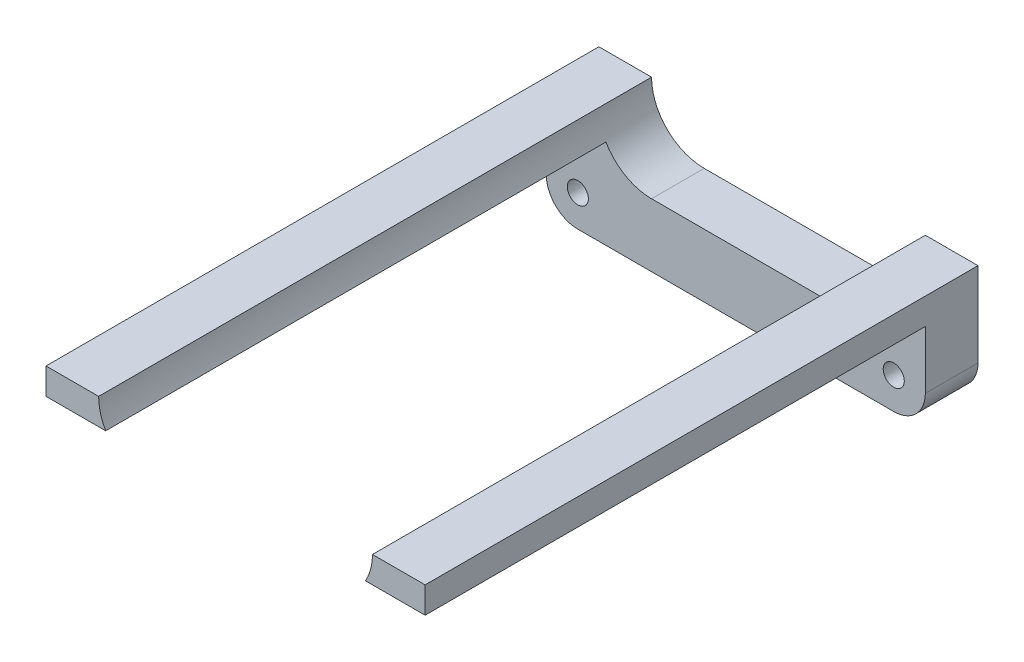
ISO-10303-21;
HEADER;
FILE_DESCRIPTION(('STEP AP214'),'2;1');
FILE_NAME('part.step','',(''),(''),'','','');
FILE_SCHEMA(('AUTOMOTIVE_DESIGN { 1 0 10303 214 1 1 1 1 }'));
ENDSEC;
DATA;
#1=APPLICATION_CONTEXT('core data for automotive mechanical design processes');
#2=APPLICATION_PROTOCOL_DEFINITION('international standard','automotive_design',2000,#1);
#3=PRODUCT_CONTEXT('',#1,'mechanical');
#4=PRODUCT('Part','Part','',(#3));
#5=PRODUCT_RELATED_PRODUCT_CATEGORY('part','',(#4));
#6=PRODUCT_DEFINITION_FORMATION('','',#4);
#7=PRODUCT_DEFINITION_CONTEXT('part definition',#1,'design');
#8=PRODUCT_DEFINITION('design','',#6,#7);
#9=PRODUCT_DEFINITION_SHAPE('','',#8);
#10=(LENGTH_UNIT() NAMED_UNIT(*) SI_UNIT(.MILLI.,.METRE.));
#11=(NAMED_UNIT(*) PLANE_ANGLE_UNIT() SI_UNIT($,.RADIAN.));
#12=(NAMED_UNIT(*) SI_UNIT($,.STERADIAN.) SOLID_ANGLE_UNIT());
#13=UNCERTAINTY_MEASURE_WITH_UNIT(LENGTH_MEASURE(1.E-05),#10,'distance_accuracy_value','');
#14=(GEOMETRIC_REPRESENTATION_CONTEXT(3) GLOBAL_UNCERTAINTY_ASSIGNED_CONTEXT((#13)) GLOBAL_UNIT_ASSIGNED_CONTEXT((#10,
#11,#12)) REPRESENTATION_CONTEXT('',''));
#15=CARTESIAN_POINT('',(0.,0.,0.));
#16=DIRECTION('',(0.,0.,1.));
#17=DIRECTION('',(1.,0.,0.));
#18=AXIS2_PLACEMENT_3D('',#15,#16,#17);
#19=CARTESIAN_POINT('',(0.,0.,5.));
#20=DIRECTION('',(0.,0.,1.));
#21=DIRECTION('',(1.,0.,0.));
#22=AXIS2_PLACEMENT_3D('',#19,#20,#21);
#23=PLANE('',#22);
#24=CARTESIAN_POINT('',(30.,0.,5.));
#25=DIRECTION('',(0.,0.,1.));
#26=DIRECTION('',(1.,0.,0.));
#27=AXIS2_PLACEMENT_3D('',#24,#25,#26);
#28=CIRCLE('',#27,2.);
#29=CARTESIAN_POINT('',(32.,0.,5.));
#30=VERTEX_POINT('',#29);
#31=EDGE_CURVE('E186',#30,#30,#28,.T.);
#32=ORIENTED_EDGE('',*,*,#31,.F.);
#33=EDGE_LOOP('',(#32));
#34=FACE_BOUND('',#33,.T.);
#35=CARTESIAN_POINT('',(-30.,0.,5.));
#36=DIRECTION('',(0.,0.,1.));
#37=DIRECTION('',(1.,0.,0.));
#38=AXIS2_PLACEMENT_3D('',#35,#36,#37);
#39=CIRCLE('',#38,2.);
#40=CARTESIAN_POINT('',(-28.,0.,5.));
#41=VERTEX_POINT('',#40);
#42=EDGE_CURVE('E189',#41,#41,#39,.T.);
#43=ORIENTED_EDGE('',*,*,#42,.F.);
#44=EDGE_LOOP('',(#43));
#45=FACE_BOUND('',#44,.T.);
#46=DIRECTION('',(1.,0.,0.));
#47=VECTOR('',#46,1.);
#48=CARTESIAN_POINT('',(0.,6.00000000000002,5.));
#49=LINE('',#48,#47);
#50=CARTESIAN_POINT('',(-16.,6.00000000000002,5.));
#51=VERTEX_POINT('',#50);
#52=CARTESIAN_POINT('',(16.,6.00000000000002,5.));
#53=VERTEX_POINT('',#52);
#54=EDGE_CURVE('E183',#51,#53,#49,.T.);
#55=ORIENTED_EDGE('',*,*,#54,.F.);
#56=CARTESIAN_POINT('',(-16.,16.,5.));
#57=DIRECTION('',(0.,0.,1.));
#58=DIRECTION('',(1.,0.,0.));
#59=AXIS2_PLACEMENT_3D('',#56,#57,#58);
#60=CIRCLE('',#59,10.);
#61=CARTESIAN_POINT('',(-24.6602540378444,11.,5.));
#62=VERTEX_POINT('',#61);
#63=EDGE_CURVE('E258',#51,#62,#60,.F.);
#64=ORIENTED_EDGE('',*,*,#63,.T.);
#65=DIRECTION('',(-1.,0.,0.));
#66=VECTOR('',#65,1.);
#67=CARTESIAN_POINT('',(0.,11.,5.));
#68=LINE('',#67,#66);
#69=CARTESIAN_POINT('',(-36.,11.,5.));
#70=VERTEX_POINT('',#69);
#71=EDGE_CURVE('E64',#62,#70,#68,.T.);
#72=ORIENTED_EDGE('',*,*,#71,.T.);
#73=DIRECTION('',(0.,1.,0.));
#74=VECTOR('',#73,1.);
#75=CARTESIAN_POINT('',(-36.,0.,5.));
#76=LINE('',#75,#74);
#77=CARTESIAN_POINT('',(-36.,0.,5.));
#78=VERTEX_POINT('',#77);
#79=EDGE_CURVE('E149',#78,#70,#76,.T.);
#80=ORIENTED_EDGE('',*,*,#79,.F.);
#81=CARTESIAN_POINT('',(-30.,0.,5.));
#82=DIRECTION('',(0.,0.,1.));
#83=DIRECTION('',(1.,0.,0.));
#84=AXIS2_PLACEMENT_3D('',#81,#82,#83);
#85=CIRCLE('',#84,6.00000000000001);
#86=CARTESIAN_POINT('',(-30.,-6.00000000000001,5.));
#87=VERTEX_POINT('',#86);
#88=EDGE_CURVE('E174',#78,#87,#85,.T.);
#89=ORIENTED_EDGE('',*,*,#88,.T.);
#90=DIRECTION('',(1.,0.,0.));
#91=VECTOR('',#90,1.);
#92=CARTESIAN_POINT('',(0.,-6.00000000000001,5.));
#93=LINE('',#92,#91);
#94=CARTESIAN_POINT('',(30.,-6.,5.));
#95=VERTEX_POINT('',#94);
#96=EDGE_CURVE('E177',#87,#95,#93,.T.);
#97=ORIENTED_EDGE('',*,*,#96,.T.);
#98=CARTESIAN_POINT('',(30.,0.,5.));
#99=DIRECTION('',(0.,0.,1.));
#100=DIRECTION('',(1.,0.,0.));
#101=AXIS2_PLACEMENT_3D('',#98,#99,#100);
#102=CIRCLE('',#101,6.00000000000001);
#103=CARTESIAN_POINT('',(36.,0.,5.));
#104=VERTEX_POINT('',#103);
#105=EDGE_CURVE('E179',#95,#104,#102,.T.);
#106=ORIENTED_EDGE('',*,*,#105,.T.);
#107=DIRECTION('',(0.,1.,0.));
#108=VECTOR('',#107,1.);
#109=CARTESIAN_POINT('',(36.,0.,5.));
#110=LINE('',#109,#108);
#111=CARTESIAN_POINT('',(36.,11.,5.));
#112=VERTEX_POINT('',#111);
#113=EDGE_CURVE('E181',#104,#112,#110,.T.);
#114=ORIENTED_EDGE('',*,*,#113,.T.);
#115=DIRECTION('',(-1.,0.,0.));
#116=VECTOR('',#115,1.);
#117=CARTESIAN_POINT('',(0.,11.,5.));
#118=LINE('',#117,#116);
#119=CARTESIAN_POINT('',(24.6602540378444,11.,5.));
#120=VERTEX_POINT('',#119);
#121=EDGE_CURVE('E238',#112,#120,#118,.T.);
#122=ORIENTED_EDGE('',*,*,#121,.T.);
#123=CARTESIAN_POINT('',(16.,16.,5.));
#124=DIRECTION('',(0.,0.,1.));
#125=DIRECTION('',(1.,0.,0.));
#126=AXIS2_PLACEMENT_3D('',#123,#124,#125);
#127=CIRCLE('',#126,10.);
#128=EDGE_CURVE('E254',#120,#53,#127,.F.);
#129=ORIENTED_EDGE('',*,*,#128,.T.);
#130=EDGE_LOOP('',(#55,#64,#72,#80,#89,#97,#106,#114,#122,#129));
#131=FACE_BOUND('',#130,.T.);
#132=ADVANCED_FACE('F43',(#34,#45,#131),#23,.T.);
#133=CARTESIAN_POINT('',(-36.,0.,5.));
#134=DIRECTION('',(-1.,0.,0.));
#135=DIRECTION('',(0.,-1.,0.));
#136=AXIS2_PLACEMENT_3D('',#133,#134,#135);
#137=PLANE('',#136);
#138=ORIENTED_EDGE('',*,*,#79,.T.);
#139=DIRECTION('',(0.,0.,-1.));
#140=VECTOR('',#139,1.);
#141=CARTESIAN_POINT('',(-36.,11.,100.));
#142=LINE('',#141,#140);
#143=CARTESIAN_POINT('',(-36.,11.,100.));
#144=VERTEX_POINT('',#143);
#145=EDGE_CURVE('E144',#144,#70,#142,.T.);
#146=ORIENTED_EDGE('',*,*,#145,.F.);
#147=DIRECTION('',(0.,1.,0.));
#148=VECTOR('',#147,1.);
#149=CARTESIAN_POINT('',(-36.,0.,100.));
#150=LINE('',#149,#148);
#151=CARTESIAN_POINT('',(-36.,16.,100.));
#152=VERTEX_POINT('',#151);
#153=EDGE_CURVE('E146',#144,#152,#150,.T.);
#154=ORIENTED_EDGE('',*,*,#153,.T.);
#155=DIRECTION('',(0.,0.,-1.));
#156=VECTOR('',#155,1.);
#157=CARTESIAN_POINT('',(-36.,16.,5.));
#158=LINE('',#157,#156);
#159=CARTESIAN_POINT('',(-36.,16.,-5.));
#160=VERTEX_POINT('',#159);
#161=EDGE_CURVE('E192',#152,#160,#158,.T.);
#162=ORIENTED_EDGE('',*,*,#161,.T.);
#163=DIRECTION('',(0.,1.,0.));
#164=VECTOR('',#163,1.);
#165=CARTESIAN_POINT('',(-36.,0.,-5.));
#166=LINE('',#165,#164);
#167=CARTESIAN_POINT('',(-36.,0.,-5.));
#168=VERTEX_POINT('',#167);
#169=EDGE_CURVE('E150',#168,#160,#166,.T.);
#170=ORIENTED_EDGE('',*,*,#169,.F.);
#171=DIRECTION('',(0.,0.,-1.));
#172=VECTOR('',#171,1.);
#173=CARTESIAN_POINT('',(-36.,0.,5.));
#174=LINE('',#173,#172);
#175=EDGE_CURVE('E236',#78,#168,#174,.T.);
#176=ORIENTED_EDGE('',*,*,#175,.F.);
#177=EDGE_LOOP('',(#138,#146,#154,#162,#170,#176));
#178=FACE_BOUND('',#177,.T.);
#179=ADVANCED_FACE('F145',(#178),#137,.T.);
#180=CARTESIAN_POINT('',(-30.,0.,5.));
#181=DIRECTION('',(0.,0.,-1.));
#182=DIRECTION('',(-1.,0.,0.));
#183=AXIS2_PLACEMENT_3D('',#180,#181,#182);
#184=CYLINDRICAL_SURFACE('',#183,6.00000000000001);
#185=CARTESIAN_POINT('',(-30.,0.,-5.));
#186=DIRECTION('',(0.,0.,1.));
#187=DIRECTION('',(1.,0.,0.));
#188=AXIS2_PLACEMENT_3D('',#185,#186,#187);
#189=CIRCLE('',#188,6.00000000000001);
#190=CARTESIAN_POINT('',(-30.,-6.00000000000001,-5.));
#191=VERTEX_POINT('',#190);
#192=EDGE_CURVE('E195',#168,#191,#189,.T.);
#193=ORIENTED_EDGE('',*,*,#192,.T.);
#194=DIRECTION('',(0.,0.,-1.));
#195=VECTOR('',#194,1.);
#196=CARTESIAN_POINT('',(-30.,-6.00000000000001,5.));
#197=LINE('',#196,#195);
#198=EDGE_CURVE('E233',#87,#191,#197,.T.);
#199=ORIENTED_EDGE('',*,*,#198,.F.);
#200=ORIENTED_EDGE('',*,*,#88,.F.);
#201=ORIENTED_EDGE('',*,*,#175,.T.);
#202=EDGE_LOOP('',(#193,#199,#200,#201));
#203=FACE_BOUND('',#202,.T.);
#204=ADVANCED_FACE('F277',(#203),#184,.T.);
#205=CARTESIAN_POINT('',(0.,-6.00000000000001,5.));
#206=DIRECTION('',(0.,1.,0.));
#207=DIRECTION('',(-1.,0.,0.));
#208=AXIS2_PLACEMENT_3D('',#205,#206,#207);
#209=PLANE('',#208);
#210=DIRECTION('',(1.,0.,0.));
#211=VECTOR('',#210,1.);
#212=CARTESIAN_POINT('',(0.,-6.00000000000001,-5.));
#213=LINE('',#212,#211);
#214=CARTESIAN_POINT('',(30.,-6.,-5.));
#215=VERTEX_POINT('',#214);
#216=EDGE_CURVE('E197',#191,#215,#213,.T.);
#217=ORIENTED_EDGE('',*,*,#216,.T.);
#218=DIRECTION('',(0.,0.,-1.));
#219=VECTOR('',#218,1.);
#220=CARTESIAN_POINT('',(30.,-6.,5.));
#221=LINE('',#220,#219);
#222=EDGE_CURVE('E230',#95,#215,#221,.T.);
#223=ORIENTED_EDGE('',*,*,#222,.F.);
#224=ORIENTED_EDGE('',*,*,#96,.F.);
#225=ORIENTED_EDGE('',*,*,#198,.T.);
#226=EDGE_LOOP('',(#217,#223,#224,#225));
#227=FACE_BOUND('',#226,.T.);
#228=ADVANCED_FACE('F281',(#227),#209,.F.);
#229=CARTESIAN_POINT('',(30.,0.,5.));
#230=DIRECTION('',(0.,0.,-1.));
#231=DIRECTION('',(-1.,0.,0.));
#232=AXIS2_PLACEMENT_3D('',#229,#230,#231);
#233=CYLINDRICAL_SURFACE('',#232,6.00000000000001);
#234=CARTESIAN_POINT('',(30.,0.,-5.));
#235=DIRECTION('',(0.,0.,1.));
#236=DIRECTION('',(1.,0.,0.));
#237=AXIS2_PLACEMENT_3D('',#234,#235,#236);
#238=CIRCLE('',#237,6.00000000000001);
#239=CARTESIAN_POINT('',(36.,0.,-5.));
#240=VERTEX_POINT('',#239);
#241=EDGE_CURVE('E199',#215,#240,#238,.T.);
#242=ORIENTED_EDGE('',*,*,#241,.T.);
#243=DIRECTION('',(0.,0.,-1.));
#244=VECTOR('',#243,1.);
#245=CARTESIAN_POINT('',(36.,0.,5.));
#246=LINE('',#245,#244);
#247=EDGE_CURVE('E227',#104,#240,#246,.T.);
#248=ORIENTED_EDGE('',*,*,#247,.F.);
#249=ORIENTED_EDGE('',*,*,#105,.F.);
#250=ORIENTED_EDGE('',*,*,#222,.T.);
#251=EDGE_LOOP('',(#242,#248,#249,#250));
#252=FACE_BOUND('',#251,.T.);
#253=ADVANCED_FACE('F288',(#252),#233,.T.);
#254=CARTESIAN_POINT('',(36.,0.,5.));
#255=DIRECTION('',(-1.,0.,0.));
#256=DIRECTION('',(0.,-1.,0.));
#257=AXIS2_PLACEMENT_3D('',#254,#255,#256);
#258=PLANE('',#257);
#259=DIRECTION('',(0.,0.,-1.));
#260=VECTOR('',#259,1.);
#261=CARTESIAN_POINT('',(36.,16.,5.));
#262=LINE('',#261,#260);
#263=CARTESIAN_POINT('',(36.,16.,100.));
#264=VERTEX_POINT('',#263);
#265=CARTESIAN_POINT('',(36.,16.,-5.));
#266=VERTEX_POINT('',#265);
#267=EDGE_CURVE('E225',#264,#266,#262,.T.);
#268=ORIENTED_EDGE('',*,*,#267,.F.);
#269=DIRECTION('',(0.,1.,0.));
#270=VECTOR('',#269,1.);
#271=CARTESIAN_POINT('',(36.,0.,100.));
#272=LINE('',#271,#270);
#273=CARTESIAN_POINT('',(36.,11.,100.));
#274=VERTEX_POINT('',#273);
#275=EDGE_CURVE('E168',#274,#264,#272,.T.);
#276=ORIENTED_EDGE('',*,*,#275,.F.);
#277=DIRECTION('',(0.,0.,-1.));
#278=VECTOR('',#277,1.);
#279=CARTESIAN_POINT('',(36.,11.,100.));
#280=LINE('',#279,#278);
#281=EDGE_CURVE('E159',#274,#112,#280,.T.);
#282=ORIENTED_EDGE('',*,*,#281,.T.);
#283=ORIENTED_EDGE('',*,*,#113,.F.);
#284=ORIENTED_EDGE('',*,*,#247,.T.);
#285=DIRECTION('',(0.,1.,0.));
#286=VECTOR('',#285,1.);
#287=CARTESIAN_POINT('',(36.,0.,-5.));
#288=LINE('',#287,#286);
#289=EDGE_CURVE('E201',#240,#266,#288,.T.);
#290=ORIENTED_EDGE('',*,*,#289,.T.);
#291=EDGE_LOOP('',(#268,#276,#282,#283,#284,#290));
#292=FACE_BOUND('',#291,.T.);
#293=ADVANCED_FACE('F291',(#292),#258,.F.);
#294=CARTESIAN_POINT('',(0.,16.,5.));
#295=DIRECTION('',(0.,-1.,0.));
#296=DIRECTION('',(1.,0.,0.));
#297=AXIS2_PLACEMENT_3D('',#294,#295,#296);
#298=PLANE('',#297);
#299=ORIENTED_EDGE('',*,*,#267,.T.);
#300=DIRECTION('',(-1.,0.,0.));
#301=VECTOR('',#300,1.);
#302=CARTESIAN_POINT('',(0.,16.,-5.));
#303=LINE('',#302,#301);
#304=CARTESIAN_POINT('',(26.,16.,-5.));
#305=VERTEX_POINT('',#304);
#306=EDGE_CURVE('E204',#266,#305,#303,.T.);
#307=ORIENTED_EDGE('',*,*,#306,.T.);
#308=DIRECTION('',(0.,0.,-1.));
#309=VECTOR('',#308,1.);
#310=CARTESIAN_POINT('',(26.,16.,5.));
#311=LINE('',#310,#309);
#312=CARTESIAN_POINT('',(26.,16.,100.));
#313=VERTEX_POINT('',#312);
#314=EDGE_CURVE('E222',#313,#305,#311,.T.);
#315=ORIENTED_EDGE('',*,*,#314,.F.);
#316=DIRECTION('',(-1.,0.,0.));
#317=VECTOR('',#316,1.);
#318=CARTESIAN_POINT('',(0.,16.,100.));
#319=LINE('',#318,#317);
#320=EDGE_CURVE('E162',#264,#313,#319,.T.);
#321=ORIENTED_EDGE('',*,*,#320,.F.);
#322=EDGE_LOOP('',(#299,#307,#315,#321));
#323=FACE_BOUND('',#322,.T.);
#324=ADVANCED_FACE('F307',(#323),#298,.F.);
#325=CARTESIAN_POINT('',(0.,6.00000000000002,5.));
#326=DIRECTION('',(0.,1.,0.));
#327=DIRECTION('',(-1.,0.,0.));
#328=AXIS2_PLACEMENT_3D('',#325,#326,#327);
#329=PLANE('',#328);
#330=ORIENTED_EDGE('',*,*,#54,.T.);
#331=DIRECTION('',(0.,0.,-1.));
#332=VECTOR('',#331,1.);
#333=CARTESIAN_POINT('',(16.,6.00000000000002,5.));
#334=LINE('',#333,#332);
#335=CARTESIAN_POINT('',(16.,6.00000000000002,-5.));
#336=VERTEX_POINT('',#335);
#337=EDGE_CURVE('E243',#53,#336,#334,.T.);
#338=ORIENTED_EDGE('',*,*,#337,.T.);
#339=DIRECTION('',(1.,0.,0.));
#340=VECTOR('',#339,1.);
#341=CARTESIAN_POINT('',(0.,6.00000000000002,-5.));
#342=LINE('',#341,#340);
#343=CARTESIAN_POINT('',(-16.,6.00000000000002,-5.));
#344=VERTEX_POINT('',#343);
#345=EDGE_CURVE('E207',#344,#336,#342,.T.);
#346=ORIENTED_EDGE('',*,*,#345,.F.);
#347=DIRECTION('',(0.,0.,-1.));
#348=VECTOR('',#347,1.);
#349=CARTESIAN_POINT('',(-16.,6.00000000000002,5.));
#350=LINE('',#349,#348);
#351=EDGE_CURVE('E241',#344,#51,#350,.F.);
#352=ORIENTED_EDGE('',*,*,#351,.T.);
#353=EDGE_LOOP('',(#330,#338,#346,#352));
#354=FACE_BOUND('',#353,.T.);
#355=ADVANCED_FACE('F301',(#354),#329,.T.);
#356=CARTESIAN_POINT('',(30.,0.,5.));
#357=DIRECTION('',(0.,0.,-1.));
#358=DIRECTION('',(-1.,0.,0.));
#359=AXIS2_PLACEMENT_3D('',#356,#357,#358);
#360=CYLINDRICAL_SURFACE('',#359,2.);
#361=ORIENTED_EDGE('',*,*,#31,.T.);
#362=EDGE_LOOP('',(#361));
#363=FACE_BOUND('',#362,.T.);
#364=CARTESIAN_POINT('',(30.,0.,-5.));
#365=DIRECTION('',(0.,0.,1.));
#366=DIRECTION('',(1.,0.,0.));
#367=AXIS2_PLACEMENT_3D('',#364,#365,#366);
#368=CIRCLE('',#367,2.);
#369=CARTESIAN_POINT('',(32.,0.,-5.));
#370=VERTEX_POINT('',#369);
#371=EDGE_CURVE('E213',#370,#370,#368,.T.);
#372=ORIENTED_EDGE('',*,*,#371,.F.);
#373=EDGE_LOOP('',(#372));
#374=FACE_BOUND('',#373,.T.);
#375=ADVANCED_FACE('F337',(#363,#374),#360,.F.);
#376=CARTESIAN_POINT('',(0.,16.,5.));
#377=DIRECTION('',(0.,1.,0.));
#378=DIRECTION('',(-1.,0.,0.));
#379=AXIS2_PLACEMENT_3D('',#376,#377,#378);
#380=PLANE('',#379);
#381=DIRECTION('',(0.,0.,-1.));
#382=VECTOR('',#381,1.);
#383=CARTESIAN_POINT('',(-26.,16.,5.));
#384=LINE('',#383,#382);
#385=CARTESIAN_POINT('',(-26.,16.,100.));
#386=VERTEX_POINT('',#385);
#387=CARTESIAN_POINT('',(-26.,16.,-5.));
#388=VERTEX_POINT('',#387);
#389=EDGE_CURVE('E219',#386,#388,#384,.T.);
#390=ORIENTED_EDGE('',*,*,#389,.T.);
#391=DIRECTION('',(1.,0.,0.));
#392=VECTOR('',#391,1.);
#393=CARTESIAN_POINT('',(0.,16.,-5.));
#394=LINE('',#393,#392);
#395=EDGE_CURVE('E210',#160,#388,#394,.T.);
#396=ORIENTED_EDGE('',*,*,#395,.F.);
#397=ORIENTED_EDGE('',*,*,#161,.F.);
#398=DIRECTION('',(1.,0.,0.));
#399=VECTOR('',#398,1.);
#400=CARTESIAN_POINT('',(0.,16.,100.));
#401=LINE('',#400,#399);
#402=EDGE_CURVE('E151',#152,#386,#401,.T.);
#403=ORIENTED_EDGE('',*,*,#402,.T.);
#404=EDGE_LOOP('',(#390,#396,#397,#403));
#405=FACE_BOUND('',#404,.T.);
#406=ADVANCED_FACE('F266',(#405),#380,.T.);
#407=CARTESIAN_POINT('',(-30.,0.,5.));
#408=DIRECTION('',(0.,0.,-1.));
#409=DIRECTION('',(-1.,0.,0.));
#410=AXIS2_PLACEMENT_3D('',#407,#408,#409);
#411=CYLINDRICAL_SURFACE('',#410,2.);
#412=ORIENTED_EDGE('',*,*,#42,.T.);
#413=EDGE_LOOP('',(#412));
#414=FACE_BOUND('',#413,.T.);
#415=CARTESIAN_POINT('',(-30.,0.,-5.));
#416=DIRECTION('',(0.,0.,1.));
#417=DIRECTION('',(1.,0.,0.));
#418=AXIS2_PLACEMENT_3D('',#415,#416,#417);
#419=CIRCLE('',#418,2.);
#420=CARTESIAN_POINT('',(-28.,0.,-5.));
#421=VERTEX_POINT('',#420);
#422=EDGE_CURVE('E175',#421,#421,#419,.T.);
#423=ORIENTED_EDGE('',*,*,#422,.F.);
#424=EDGE_LOOP('',(#423));
#425=FACE_BOUND('',#424,.T.);
#426=ADVANCED_FACE('F333',(#414,#425),#411,.F.);
#427=CARTESIAN_POINT('',(0.,0.,-5.));
#428=DIRECTION('',(0.,0.,1.));
#429=DIRECTION('',(1.,0.,0.));
#430=AXIS2_PLACEMENT_3D('',#427,#428,#429);
#431=PLANE('',#430);
#432=ORIENTED_EDGE('',*,*,#169,.T.);
#433=ORIENTED_EDGE('',*,*,#395,.T.);
#434=CARTESIAN_POINT('',(-16.,16.,-5.));
#435=DIRECTION('',(0.,0.,1.));
#436=DIRECTION('',(1.,0.,0.));
#437=AXIS2_PLACEMENT_3D('',#434,#435,#436);
#438=CIRCLE('',#437,10.);
#439=EDGE_CURVE('E256',#388,#344,#438,.T.);
#440=ORIENTED_EDGE('',*,*,#439,.T.);
#441=ORIENTED_EDGE('',*,*,#345,.T.);
#442=CARTESIAN_POINT('',(16.,16.,-5.));
#443=DIRECTION('',(0.,0.,1.));
#444=DIRECTION('',(1.,0.,0.));
#445=AXIS2_PLACEMENT_3D('',#442,#443,#444);
#446=CIRCLE('',#445,10.);
#447=EDGE_CURVE('E246',#336,#305,#446,.T.);
#448=ORIENTED_EDGE('',*,*,#447,.T.);
#449=ORIENTED_EDGE('',*,*,#306,.F.);
#450=ORIENTED_EDGE('',*,*,#289,.F.);
#451=ORIENTED_EDGE('',*,*,#241,.F.);
#452=ORIENTED_EDGE('',*,*,#216,.F.);
#453=ORIENTED_EDGE('',*,*,#192,.F.);
#454=EDGE_LOOP('',(#432,#433,#440,#441,#448,#449,#450,#451,#452,#453));
#455=FACE_BOUND('',#454,.T.);
#456=ORIENTED_EDGE('',*,*,#371,.T.);
#457=EDGE_LOOP('',(#456));
#458=FACE_BOUND('',#457,.T.);
#459=ORIENTED_EDGE('',*,*,#422,.T.);
#460=EDGE_LOOP('',(#459));
#461=FACE_BOUND('',#460,.T.);
#462=ADVANCED_FACE('F271',(#455,#458,#461),#431,.F.);
#463=CARTESIAN_POINT('',(0.,11.,100.));
#464=DIRECTION('',(0.,1.,0.));
#465=DIRECTION('',(0.,0.,1.));
#466=AXIS2_PLACEMENT_3D('',#463,#464,#465);
#467=PLANE('',#466);
#468=ORIENTED_EDGE('',*,*,#121,.F.);
#469=ORIENTED_EDGE('',*,*,#281,.F.);
#470=DIRECTION('',(1.,0.,0.));
#471=VECTOR('',#470,1.);
#472=CARTESIAN_POINT('',(0.,11.,100.));
#473=LINE('',#472,#471);
#474=CARTESIAN_POINT('',(24.6602540378444,11.,100.));
#475=VERTEX_POINT('',#474);
#476=EDGE_CURVE('E166',#475,#274,#473,.T.);
#477=ORIENTED_EDGE('',*,*,#476,.F.);
#478=DIRECTION('',(0.,0.,-1.));
#479=VECTOR('',#478,1.);
#480=CARTESIAN_POINT('',(24.6602540378444,11.,100.));
#481=LINE('',#480,#479);
#482=EDGE_CURVE('E251',#475,#120,#481,.T.);
#483=ORIENTED_EDGE('',*,*,#482,.T.);
#484=EDGE_LOOP('',(#468,#469,#477,#483));
#485=FACE_BOUND('',#484,.T.);
#486=ADVANCED_FACE('F295',(#485),#467,.F.);
#487=CARTESIAN_POINT('',(0.,0.,100.));
#488=DIRECTION('',(0.,0.,1.));
#489=DIRECTION('',(1.,0.,0.));
#490=AXIS2_PLACEMENT_3D('',#487,#488,#489);
#491=PLANE('',#490);
#492=ORIENTED_EDGE('',*,*,#320,.T.);
#493=CARTESIAN_POINT('',(16.,16.,100.));
#494=DIRECTION('',(0.,0.,1.));
#495=DIRECTION('',(1.,0.,0.));
#496=AXIS2_PLACEMENT_3D('',#493,#494,#495);
#497=CIRCLE('',#496,10.);
#498=EDGE_CURVE('E248',#313,#475,#497,.F.);
#499=ORIENTED_EDGE('',*,*,#498,.T.);
#500=ORIENTED_EDGE('',*,*,#476,.T.);
#501=ORIENTED_EDGE('',*,*,#275,.T.);
#502=EDGE_LOOP('',(#492,#499,#500,#501));
#503=FACE_BOUND('',#502,.T.);
#504=ADVANCED_FACE('F310',(#503),#491,.T.);
#505=CARTESIAN_POINT('',(0.,11.,100.));
#506=DIRECTION('',(0.,1.,0.));
#507=DIRECTION('',(0.,0.,1.));
#508=AXIS2_PLACEMENT_3D('',#505,#506,#507);
#509=PLANE('',#508);
#510=ORIENTED_EDGE('',*,*,#71,.F.);
#511=DIRECTION('',(0.,0.,1.));
#512=VECTOR('',#511,1.);
#513=CARTESIAN_POINT('',(-24.6602540378444,11.,5.));
#514=LINE('',#513,#512);
#515=CARTESIAN_POINT('',(-24.6602540378444,11.,100.));
#516=VERTEX_POINT('',#515);
#517=EDGE_CURVE('E51',#62,#516,#514,.T.);
#518=ORIENTED_EDGE('',*,*,#517,.T.);
#519=DIRECTION('',(1.,0.,0.));
#520=VECTOR('',#519,1.);
#521=CARTESIAN_POINT('',(0.,11.,100.));
#522=LINE('',#521,#520);
#523=EDGE_CURVE('E57',#144,#516,#522,.T.);
#524=ORIENTED_EDGE('',*,*,#523,.F.);
#525=ORIENTED_EDGE('',*,*,#145,.T.);
#526=EDGE_LOOP('',(#510,#518,#524,#525));
#527=FACE_BOUND('',#526,.T.);
#528=ADVANCED_FACE('F153',(#527),#509,.F.);
#529=CARTESIAN_POINT('',(0.,0.,100.));
#530=DIRECTION('',(0.,0.,1.));
#531=DIRECTION('',(1.,0.,0.));
#532=AXIS2_PLACEMENT_3D('',#529,#530,#531);
#533=PLANE('',#532);
#534=ORIENTED_EDGE('',*,*,#153,.F.);
#535=ORIENTED_EDGE('',*,*,#523,.T.);
#536=CARTESIAN_POINT('',(-16.,16.,100.));
#537=DIRECTION('',(0.,0.,1.));
#538=DIRECTION('',(1.,0.,0.));
#539=AXIS2_PLACEMENT_3D('',#536,#537,#538);
#540=CIRCLE('',#539,10.);
#541=EDGE_CURVE('E11',#516,#386,#540,.F.);
#542=ORIENTED_EDGE('',*,*,#541,.T.);
#543=ORIENTED_EDGE('',*,*,#402,.F.);
#544=EDGE_LOOP('',(#534,#535,#542,#543));
#545=FACE_BOUND('',#544,.T.);
#546=ADVANCED_FACE('F157',(#545),#533,.T.);
#547=CARTESIAN_POINT('',(16.,16.,5.));
#548=DIRECTION('',(0.,0.,-1.));
#549=DIRECTION('',(-1.,0.,0.));
#550=AXIS2_PLACEMENT_3D('',#547,#548,#549);
#551=CYLINDRICAL_SURFACE('',#550,10.);
#552=ORIENTED_EDGE('',*,*,#498,.F.);
#553=ORIENTED_EDGE('',*,*,#314,.T.);
#554=ORIENTED_EDGE('',*,*,#447,.F.);
#555=ORIENTED_EDGE('',*,*,#337,.F.);
#556=ORIENTED_EDGE('',*,*,#128,.F.);
#557=ORIENTED_EDGE('',*,*,#482,.F.);
#558=EDGE_LOOP('',(#552,#553,#554,#555,#556,#557));
#559=FACE_BOUND('',#558,.T.);
#560=ADVANCED_FACE('F304',(#559),#551,.F.);
#561=CARTESIAN_POINT('',(-16.,16.,5.));
#562=DIRECTION('',(0.,0.,1.));
#563=DIRECTION('',(1.,0.,0.));
#564=AXIS2_PLACEMENT_3D('',#561,#562,#563);
#565=CYLINDRICAL_SURFACE('',#564,10.);
#566=ORIENTED_EDGE('',*,*,#63,.F.);
#567=ORIENTED_EDGE('',*,*,#351,.F.);
#568=ORIENTED_EDGE('',*,*,#439,.F.);
#569=ORIENTED_EDGE('',*,*,#389,.F.);
#570=ORIENTED_EDGE('',*,*,#541,.F.);
#571=ORIENTED_EDGE('',*,*,#517,.F.);
#572=EDGE_LOOP('',(#566,#567,#568,#569,#570,#571));
#573=FACE_BOUND('',#572,.T.);
#574=ADVANCED_FACE('F45',(#573),#565,.F.);
#575=CLOSED_SHELL('',(#132,#179,#204,#228,#253,#293,#324,#355,#375,#406,#426,#462,#486,#504,
#528,#546,#560,#574));
#576=MANIFOLD_SOLID_BREP('B2',#575);
#577=ADVANCED_BREP_SHAPE_REPRESENTATION('',(#18,#576),#14);
#578=SHAPE_DEFINITION_REPRESENTATION(#9,#577);
ENDSEC;
END-ISO-10303-21;
